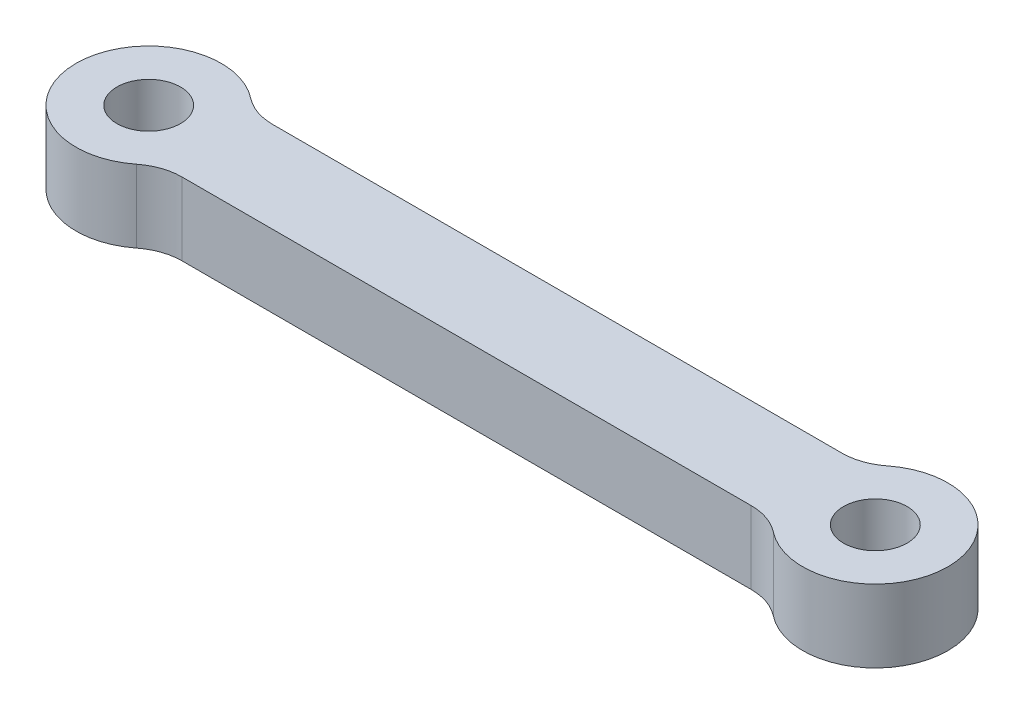
ISO-10303-21;
HEADER;
FILE_DESCRIPTION(('STEP AP214'),'2;1');
FILE_NAME('part.step','',(''),(''),'','','');
FILE_SCHEMA(('AUTOMOTIVE_DESIGN { 1 0 10303 214 1 1 1 1 }'));
ENDSEC;
DATA;
#1=APPLICATION_CONTEXT('core data for automotive mechanical design processes');
#2=APPLICATION_PROTOCOL_DEFINITION('international standard','automotive_design',2000,#1);
#3=PRODUCT_CONTEXT('',#1,'mechanical');
#4=PRODUCT('Part','Part','',(#3));
#5=PRODUCT_RELATED_PRODUCT_CATEGORY('part','',(#4));
#6=PRODUCT_DEFINITION_FORMATION('','',#4);
#7=PRODUCT_DEFINITION_CONTEXT('part definition',#1,'design');
#8=PRODUCT_DEFINITION('design','',#6,#7);
#9=PRODUCT_DEFINITION_SHAPE('','',#8);
#10=(LENGTH_UNIT() NAMED_UNIT(*) SI_UNIT(.MILLI.,.METRE.));
#11=(NAMED_UNIT(*) PLANE_ANGLE_UNIT() SI_UNIT($,.RADIAN.));
#12=(NAMED_UNIT(*) SI_UNIT($,.STERADIAN.) SOLID_ANGLE_UNIT());
#13=UNCERTAINTY_MEASURE_WITH_UNIT(LENGTH_MEASURE(1.E-05),#10,'distance_accuracy_value','');
#14=(GEOMETRIC_REPRESENTATION_CONTEXT(3) GLOBAL_UNCERTAINTY_ASSIGNED_CONTEXT((#13)) GLOBAL_UNIT_ASSIGNED_CONTEXT((#10,
#11,#12)) REPRESENTATION_CONTEXT('',''));
#15=CARTESIAN_POINT('',(0.,0.,0.));
#16=DIRECTION('',(0.,0.,1.));
#17=DIRECTION('',(1.,0.,0.));
#18=AXIS2_PLACEMENT_3D('',#15,#16,#17);
#19=CARTESIAN_POINT('',(40.,4.,0.));
#20=DIRECTION('',(0.,-1.,0.));
#21=DIRECTION('',(0.,0.,-1.));
#22=AXIS2_PLACEMENT_3D('',#19,#20,#21);
#23=CYLINDRICAL_SURFACE('',#22,4.00000000000003);
#24=CARTESIAN_POINT('',(40.,4.,0.));
#25=DIRECTION('',(0.,1.,0.));
#26=DIRECTION('',(0.,0.,1.));
#27=AXIS2_PLACEMENT_3D('',#24,#25,#26);
#28=CIRCLE('',#27,4.00000000000003);
#29=CARTESIAN_POINT('',(37.525641703473,4.,3.14285714285715));
#30=VERTEX_POINT('',#29);
#31=CARTESIAN_POINT('',(37.525641703473,4.,-3.14285714285715));
#32=VERTEX_POINT('',#31);
#33=EDGE_CURVE('E160',#30,#32,#28,.T.);
#34=ORIENTED_EDGE('',*,*,#33,.F.);
#35=DIRECTION('',(0.,-1.,0.));
#36=VECTOR('',#35,1.);
#37=CARTESIAN_POINT('',(37.525641703473,4.,3.14285714285715));
#38=LINE('',#37,#36);
#39=CARTESIAN_POINT('',(37.525641703473,0.,3.14285714285715));
#40=VERTEX_POINT('',#39);
#41=EDGE_CURVE('E172',#30,#40,#38,.T.);
#42=ORIENTED_EDGE('',*,*,#41,.T.);
#43=CARTESIAN_POINT('',(40.,0.,0.));
#44=DIRECTION('',(0.,1.,0.));
#45=DIRECTION('',(0.,0.,1.));
#46=AXIS2_PLACEMENT_3D('',#43,#44,#45);
#47=CIRCLE('',#46,4.00000000000003);
#48=CARTESIAN_POINT('',(37.525641703473,0.,-3.14285714285715));
#49=VERTEX_POINT('',#48);
#50=EDGE_CURVE('E199',#40,#49,#47,.T.);
#51=ORIENTED_EDGE('',*,*,#50,.T.);
#52=DIRECTION('',(0.,-1.,0.));
#53=VECTOR('',#52,1.);
#54=CARTESIAN_POINT('',(37.525641703473,4.,-3.14285714285715));
#55=LINE('',#54,#53);
#56=EDGE_CURVE('E169',#49,#32,#55,.F.);
#57=ORIENTED_EDGE('',*,*,#56,.T.);
#58=EDGE_LOOP('',(#34,#42,#51,#57));
#59=FACE_BOUND('',#58,.T.);
#60=ADVANCED_FACE('F47',(#59),#23,.T.);
#61=CARTESIAN_POINT('',(0.,4.,-2.5));
#62=DIRECTION('',(0.,0.,-1.));
#63=DIRECTION('',(-1.,0.,0.));
#64=AXIS2_PLACEMENT_3D('',#61,#62,#63);
#65=PLANE('',#64);
#66=DIRECTION('',(1.,0.,0.));
#67=VECTOR('',#66,1.);
#68=CARTESIAN_POINT('',(0.,4.,-2.5));
#69=LINE('',#68,#67);
#70=CARTESIAN_POINT('',(4.33012701892219,4.,-2.5));
#71=VERTEX_POINT('',#70);
#72=CARTESIAN_POINT('',(35.6698729810778,4.,-2.5));
#73=VERTEX_POINT('',#72);
#74=EDGE_CURVE('E206',#71,#73,#69,.T.);
#75=ORIENTED_EDGE('',*,*,#74,.T.);
#76=DIRECTION('',(0.,-1.,0.));
#77=VECTOR('',#76,1.);
#78=CARTESIAN_POINT('',(35.6698729810778,4.,-2.5));
#79=LINE('',#78,#77);
#80=CARTESIAN_POINT('',(35.6698729810778,0.,-2.5));
#81=VERTEX_POINT('',#80);
#82=EDGE_CURVE('E126',#73,#81,#79,.T.);
#83=ORIENTED_EDGE('',*,*,#82,.T.);
#84=DIRECTION('',(1.,0.,0.));
#85=VECTOR('',#84,1.);
#86=CARTESIAN_POINT('',(0.,0.,-2.5));
#87=LINE('',#86,#85);
#88=CARTESIAN_POINT('',(4.33012701892219,0.,-2.5));
#89=VERTEX_POINT('',#88);
#90=EDGE_CURVE('E153',#89,#81,#87,.T.);
#91=ORIENTED_EDGE('',*,*,#90,.F.);
#92=DIRECTION('',(0.,-1.,0.));
#93=VECTOR('',#92,1.);
#94=CARTESIAN_POINT('',(4.33012701892219,4.,-2.5));
#95=LINE('',#94,#93);
#96=EDGE_CURVE('E70',#89,#71,#95,.F.);
#97=ORIENTED_EDGE('',*,*,#96,.T.);
#98=EDGE_LOOP('',(#75,#83,#91,#97));
#99=FACE_BOUND('',#98,.T.);
#100=ADVANCED_FACE('F196',(#99),#65,.T.);
#101=CARTESIAN_POINT('',(0.,4.,0.));
#102=DIRECTION('',(0.,-1.,0.));
#103=DIRECTION('',(0.,0.,-1.));
#104=AXIS2_PLACEMENT_3D('',#101,#102,#103);
#105=CYLINDRICAL_SURFACE('',#104,4.);
#106=CARTESIAN_POINT('',(0.,0.,0.));
#107=DIRECTION('',(0.,1.,0.));
#108=DIRECTION('',(0.,0.,1.));
#109=AXIS2_PLACEMENT_3D('',#106,#107,#108);
#110=CIRCLE('',#109,4.);
#111=CARTESIAN_POINT('',(2.47435829652697,0.,-3.14285714285714));
#112=VERTEX_POINT('',#111);
#113=CARTESIAN_POINT('',(2.47435829652697,0.,3.14285714285714));
#114=VERTEX_POINT('',#113);
#115=EDGE_CURVE('E146',#112,#114,#110,.T.);
#116=ORIENTED_EDGE('',*,*,#115,.T.);
#117=DIRECTION('',(0.,-1.,0.));
#118=VECTOR('',#117,1.);
#119=CARTESIAN_POINT('',(2.47435829652697,4.,3.14285714285714));
#120=LINE('',#119,#118);
#121=CARTESIAN_POINT('',(2.47435829652697,4.,3.14285714285714));
#122=VERTEX_POINT('',#121);
#123=EDGE_CURVE('E119',#114,#122,#120,.F.);
#124=ORIENTED_EDGE('',*,*,#123,.T.);
#125=CARTESIAN_POINT('',(0.,4.,0.));
#126=DIRECTION('',(0.,1.,0.));
#127=DIRECTION('',(0.,0.,1.));
#128=AXIS2_PLACEMENT_3D('',#125,#126,#127);
#129=CIRCLE('',#128,4.);
#130=CARTESIAN_POINT('',(2.47435829652697,4.,-3.14285714285714));
#131=VERTEX_POINT('',#130);
#132=EDGE_CURVE('E205',#131,#122,#129,.T.);
#133=ORIENTED_EDGE('',*,*,#132,.F.);
#134=DIRECTION('',(0.,-1.,0.));
#135=VECTOR('',#134,1.);
#136=CARTESIAN_POINT('',(2.47435829652697,4.,-3.14285714285714));
#137=LINE('',#136,#135);
#138=EDGE_CURVE('E137',#131,#112,#137,.T.);
#139=ORIENTED_EDGE('',*,*,#138,.T.);
#140=EDGE_LOOP('',(#116,#124,#133,#139));
#141=FACE_BOUND('',#140,.T.);
#142=ADVANCED_FACE('F208',(#141),#105,.T.);
#143=CARTESIAN_POINT('',(0.,4.,0.));
#144=DIRECTION('',(0.,-1.,0.));
#145=DIRECTION('',(0.,0.,-1.));
#146=AXIS2_PLACEMENT_3D('',#143,#144,#145);
#147=CYLINDRICAL_SURFACE('',#146,1.75);
#148=CARTESIAN_POINT('',(0.,4.,0.));
#149=DIRECTION('',(0.,1.,0.));
#150=DIRECTION('',(0.,0.,1.));
#151=AXIS2_PLACEMENT_3D('',#148,#149,#150);
#152=CIRCLE('',#151,1.75);
#153=CARTESIAN_POINT('',(0.,4.,1.75));
#154=VERTEX_POINT('',#153);
#155=EDGE_CURVE('E213',#154,#154,#152,.T.);
#156=ORIENTED_EDGE('',*,*,#155,.T.);
#157=EDGE_LOOP('',(#156));
#158=FACE_BOUND('',#157,.T.);
#159=CARTESIAN_POINT('',(0.,0.,0.));
#160=DIRECTION('',(0.,1.,0.));
#161=DIRECTION('',(0.,0.,1.));
#162=AXIS2_PLACEMENT_3D('',#159,#160,#161);
#163=CIRCLE('',#162,1.75);
#164=CARTESIAN_POINT('',(0.,0.,1.75));
#165=VERTEX_POINT('',#164);
#166=EDGE_CURVE('E145',#165,#165,#163,.T.);
#167=ORIENTED_EDGE('',*,*,#166,.F.);
#168=EDGE_LOOP('',(#167));
#169=FACE_BOUND('',#168,.T.);
#170=ADVANCED_FACE('F262',(#158,#169),#147,.F.);
#171=CARTESIAN_POINT('',(0.,4.,2.5));
#172=DIRECTION('',(0.,0.,-1.));
#173=DIRECTION('',(-1.,0.,0.));
#174=AXIS2_PLACEMENT_3D('',#171,#172,#173);
#175=PLANE('',#174);
#176=DIRECTION('',(1.,0.,0.));
#177=VECTOR('',#176,1.);
#178=CARTESIAN_POINT('',(0.,4.,2.5));
#179=LINE('',#178,#177);
#180=CARTESIAN_POINT('',(4.3301270189222,4.,2.5));
#181=VERTEX_POINT('',#180);
#182=CARTESIAN_POINT('',(35.6698729810778,4.,2.5));
#183=VERTEX_POINT('',#182);
#184=EDGE_CURVE('E135',#181,#183,#179,.T.);
#185=ORIENTED_EDGE('',*,*,#184,.F.);
#186=DIRECTION('',(0.,1.,0.));
#187=VECTOR('',#186,1.);
#188=CARTESIAN_POINT('',(4.3301270189222,0.,2.5));
#189=LINE('',#188,#187);
#190=CARTESIAN_POINT('',(4.3301270189222,0.,2.5));
#191=VERTEX_POINT('',#190);
#192=EDGE_CURVE('E118',#181,#191,#189,.F.);
#193=ORIENTED_EDGE('',*,*,#192,.T.);
#194=DIRECTION('',(1.,0.,0.));
#195=VECTOR('',#194,1.);
#196=CARTESIAN_POINT('',(0.,0.,2.5));
#197=LINE('',#196,#195);
#198=CARTESIAN_POINT('',(35.6698729810778,0.,2.5));
#199=VERTEX_POINT('',#198);
#200=EDGE_CURVE('E132',#191,#199,#197,.T.);
#201=ORIENTED_EDGE('',*,*,#200,.T.);
#202=DIRECTION('',(0.,1.,0.));
#203=VECTOR('',#202,1.);
#204=CARTESIAN_POINT('',(35.6698729810778,4.,2.5));
#205=LINE('',#204,#203);
#206=EDGE_CURVE('E138',#199,#183,#205,.T.);
#207=ORIENTED_EDGE('',*,*,#206,.T.);
#208=EDGE_LOOP('',(#185,#193,#201,#207));
#209=FACE_BOUND('',#208,.T.);
#210=ADVANCED_FACE('F131',(#209),#175,.F.);
#211=CARTESIAN_POINT('',(40.,4.,0.));
#212=DIRECTION('',(0.,-1.,0.));
#213=DIRECTION('',(0.,0.,-1.));
#214=AXIS2_PLACEMENT_3D('',#211,#212,#213);
#215=CYLINDRICAL_SURFACE('',#214,1.75);
#216=CARTESIAN_POINT('',(40.,4.,0.));
#217=DIRECTION('',(0.,1.,0.));
#218=DIRECTION('',(0.,0.,1.));
#219=AXIS2_PLACEMENT_3D('',#216,#217,#218);
#220=CIRCLE('',#219,1.75);
#221=CARTESIAN_POINT('',(40.,4.,1.75));
#222=VERTEX_POINT('',#221);
#223=EDGE_CURVE('E162',#222,#222,#220,.T.);
#224=ORIENTED_EDGE('',*,*,#223,.T.);
#225=EDGE_LOOP('',(#224));
#226=FACE_BOUND('',#225,.T.);
#227=CARTESIAN_POINT('',(40.,0.,0.));
#228=DIRECTION('',(0.,1.,0.));
#229=DIRECTION('',(0.,0.,1.));
#230=AXIS2_PLACEMENT_3D('',#227,#228,#229);
#231=CIRCLE('',#230,1.75);
#232=CARTESIAN_POINT('',(40.,0.,1.75));
#233=VERTEX_POINT('',#232);
#234=EDGE_CURVE('E151',#233,#233,#231,.T.);
#235=ORIENTED_EDGE('',*,*,#234,.F.);
#236=EDGE_LOOP('',(#235));
#237=FACE_BOUND('',#236,.T.);
#238=ADVANCED_FACE('F256',(#226,#237),#215,.F.);
#239=CARTESIAN_POINT('',(0.,4.,0.));
#240=DIRECTION('',(0.,1.,0.));
#241=DIRECTION('',(0.,0.,1.));
#242=AXIS2_PLACEMENT_3D('',#239,#240,#241);
#243=PLANE('',#242);
#244=ORIENTED_EDGE('',*,*,#184,.T.);
#245=CARTESIAN_POINT('',(35.6698729810778,4.,5.5));
#246=DIRECTION('',(0.,1.,0.));
#247=DIRECTION('',(0.,0.,1.));
#248=AXIS2_PLACEMENT_3D('',#245,#246,#247);
#249=CIRCLE('',#248,3.);
#250=EDGE_CURVE('E185',#183,#30,#249,.F.);
#251=ORIENTED_EDGE('',*,*,#250,.T.);
#252=ORIENTED_EDGE('',*,*,#33,.T.);
#253=CARTESIAN_POINT('',(35.6698729810778,4.,-5.5));
#254=DIRECTION('',(0.,1.,0.));
#255=DIRECTION('',(0.,0.,1.));
#256=AXIS2_PLACEMENT_3D('',#253,#254,#255);
#257=CIRCLE('',#256,3.);
#258=EDGE_CURVE('E63',#32,#73,#257,.F.);
#259=ORIENTED_EDGE('',*,*,#258,.T.);
#260=ORIENTED_EDGE('',*,*,#74,.F.);
#261=CARTESIAN_POINT('',(4.33012701892219,4.,-5.5));
#262=DIRECTION('',(0.,1.,0.));
#263=DIRECTION('',(0.,0.,1.));
#264=AXIS2_PLACEMENT_3D('',#261,#262,#263);
#265=CIRCLE('',#264,3.);
#266=EDGE_CURVE('E11',#71,#131,#265,.F.);
#267=ORIENTED_EDGE('',*,*,#266,.T.);
#268=ORIENTED_EDGE('',*,*,#132,.T.);
#269=CARTESIAN_POINT('',(4.3301270189222,4.,5.5));
#270=DIRECTION('',(0.,1.,0.));
#271=DIRECTION('',(0.,0.,1.));
#272=AXIS2_PLACEMENT_3D('',#269,#270,#271);
#273=CIRCLE('',#272,3.);
#274=EDGE_CURVE('E125',#122,#181,#273,.F.);
#275=ORIENTED_EDGE('',*,*,#274,.T.);
#276=EDGE_LOOP('',(#244,#251,#252,#259,#260,#267,#268,#275));
#277=FACE_BOUND('',#276,.T.);
#278=ORIENTED_EDGE('',*,*,#155,.F.);
#279=EDGE_LOOP('',(#278));
#280=FACE_BOUND('',#279,.T.);
#281=ORIENTED_EDGE('',*,*,#223,.F.);
#282=EDGE_LOOP('',(#281));
#283=FACE_BOUND('',#282,.T.);
#284=ADVANCED_FACE('F203',(#277,#280,#283),#243,.T.);
#285=CARTESIAN_POINT('',(0.,0.,0.));
#286=DIRECTION('',(0.,1.,0.));
#287=DIRECTION('',(0.,0.,1.));
#288=AXIS2_PLACEMENT_3D('',#285,#286,#287);
#289=PLANE('',#288);
#290=ORIENTED_EDGE('',*,*,#50,.F.);
#291=CARTESIAN_POINT('',(35.6698729810778,0.,5.5));
#292=DIRECTION('',(0.,1.,0.));
#293=DIRECTION('',(0.,0.,1.));
#294=AXIS2_PLACEMENT_3D('',#291,#292,#293);
#295=CIRCLE('',#294,3.);
#296=EDGE_CURVE('E143',#40,#199,#295,.T.);
#297=ORIENTED_EDGE('',*,*,#296,.T.);
#298=ORIENTED_EDGE('',*,*,#200,.F.);
#299=CARTESIAN_POINT('',(4.3301270189222,0.,5.5));
#300=DIRECTION('',(0.,1.,0.));
#301=DIRECTION('',(0.,0.,1.));
#302=AXIS2_PLACEMENT_3D('',#299,#300,#301);
#303=CIRCLE('',#302,3.);
#304=EDGE_CURVE('E114',#191,#114,#303,.T.);
#305=ORIENTED_EDGE('',*,*,#304,.T.);
#306=ORIENTED_EDGE('',*,*,#115,.F.);
#307=CARTESIAN_POINT('',(4.33012701892219,0.,-5.5));
#308=DIRECTION('',(0.,1.,0.));
#309=DIRECTION('',(0.,0.,1.));
#310=AXIS2_PLACEMENT_3D('',#307,#308,#309);
#311=CIRCLE('',#310,3.);
#312=EDGE_CURVE('E56',#112,#89,#311,.T.);
#313=ORIENTED_EDGE('',*,*,#312,.T.);
#314=ORIENTED_EDGE('',*,*,#90,.T.);
#315=CARTESIAN_POINT('',(35.6698729810778,0.,-5.5));
#316=DIRECTION('',(0.,1.,0.));
#317=DIRECTION('',(0.,0.,1.));
#318=AXIS2_PLACEMENT_3D('',#315,#316,#317);
#319=CIRCLE('',#318,3.);
#320=EDGE_CURVE('E188',#81,#49,#319,.T.);
#321=ORIENTED_EDGE('',*,*,#320,.T.);
#322=EDGE_LOOP('',(#290,#297,#298,#305,#306,#313,#314,#321));
#323=FACE_BOUND('',#322,.T.);
#324=ORIENTED_EDGE('',*,*,#166,.T.);
#325=EDGE_LOOP('',(#324));
#326=FACE_BOUND('',#325,.T.);
#327=ORIENTED_EDGE('',*,*,#234,.T.);
#328=EDGE_LOOP('',(#327));
#329=FACE_BOUND('',#328,.T.);
#330=ADVANCED_FACE('F141',(#323,#326,#329),#289,.F.);
#331=CARTESIAN_POINT('',(4.3301270189222,4.,5.5));
#332=DIRECTION('',(0.,-1.,0.));
#333=DIRECTION('',(0.,0.,-1.));
#334=AXIS2_PLACEMENT_3D('',#331,#332,#333);
#335=CYLINDRICAL_SURFACE('',#334,3.);
#336=ORIENTED_EDGE('',*,*,#274,.F.);
#337=ORIENTED_EDGE('',*,*,#123,.F.);
#338=ORIENTED_EDGE('',*,*,#304,.F.);
#339=ORIENTED_EDGE('',*,*,#192,.F.);
#340=EDGE_LOOP('',(#336,#337,#338,#339));
#341=FACE_BOUND('',#340,.T.);
#342=ADVANCED_FACE('F117',(#341),#335,.F.);
#343=CARTESIAN_POINT('',(35.6698729810778,4.,5.5));
#344=DIRECTION('',(0.,-1.,0.));
#345=DIRECTION('',(0.,0.,-1.));
#346=AXIS2_PLACEMENT_3D('',#343,#344,#345);
#347=CYLINDRICAL_SURFACE('',#346,3.);
#348=ORIENTED_EDGE('',*,*,#250,.F.);
#349=ORIENTED_EDGE('',*,*,#206,.F.);
#350=ORIENTED_EDGE('',*,*,#296,.F.);
#351=ORIENTED_EDGE('',*,*,#41,.F.);
#352=EDGE_LOOP('',(#348,#349,#350,#351));
#353=FACE_BOUND('',#352,.T.);
#354=ADVANCED_FACE('F233',(#353),#347,.F.);
#355=CARTESIAN_POINT('',(35.6698729810778,4.,-5.5));
#356=DIRECTION('',(0.,-1.,0.));
#357=DIRECTION('',(0.,0.,-1.));
#358=AXIS2_PLACEMENT_3D('',#355,#356,#357);
#359=CYLINDRICAL_SURFACE('',#358,3.);
#360=ORIENTED_EDGE('',*,*,#258,.F.);
#361=ORIENTED_EDGE('',*,*,#56,.F.);
#362=ORIENTED_EDGE('',*,*,#320,.F.);
#363=ORIENTED_EDGE('',*,*,#82,.F.);
#364=EDGE_LOOP('',(#360,#361,#362,#363));
#365=FACE_BOUND('',#364,.T.);
#366=ADVANCED_FACE('F231',(#365),#359,.F.);
#367=CARTESIAN_POINT('',(4.33012701892219,4.,-5.5));
#368=DIRECTION('',(0.,-1.,0.));
#369=DIRECTION('',(0.,0.,-1.));
#370=AXIS2_PLACEMENT_3D('',#367,#368,#369);
#371=CYLINDRICAL_SURFACE('',#370,3.);
#372=ORIENTED_EDGE('',*,*,#266,.F.);
#373=ORIENTED_EDGE('',*,*,#96,.F.);
#374=ORIENTED_EDGE('',*,*,#312,.F.);
#375=ORIENTED_EDGE('',*,*,#138,.F.);
#376=EDGE_LOOP('',(#372,#373,#374,#375));
#377=FACE_BOUND('',#376,.T.);
#378=ADVANCED_FACE('F49',(#377),#371,.F.);
#379=CLOSED_SHELL('',(#60,#100,#142,#170,#210,#238,#284,#330,#342,#354,#366,#378));
#380=MANIFOLD_SOLID_BREP('B2',#379);
#381=ADVANCED_BREP_SHAPE_REPRESENTATION('',(#18,#380),#14);
#382=SHAPE_DEFINITION_REPRESENTATION(#9,#381);
ENDSEC;
END-ISO-10303-21;
